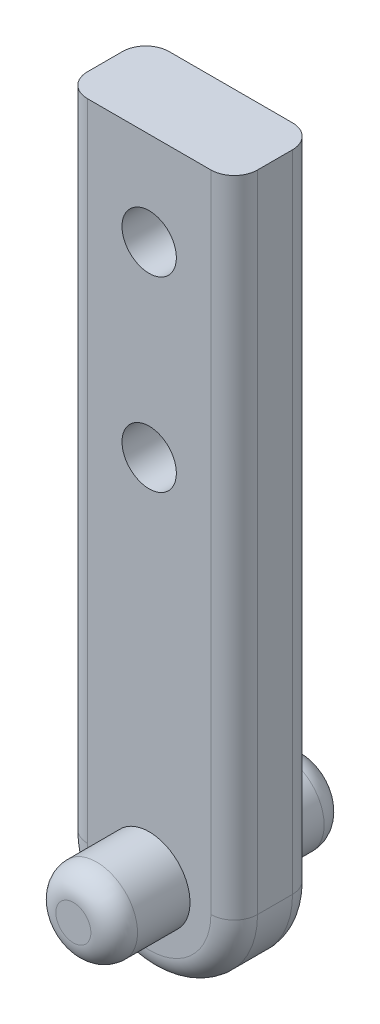
ISO-10303-21;
HEADER;
FILE_DESCRIPTION(('STEP AP214'),'2;1');
FILE_NAME('part.step','',(''),(''),'','','');
FILE_SCHEMA(('AUTOMOTIVE_DESIGN { 1 0 10303 214 1 1 1 1 }'));
ENDSEC;
DATA;
#1=APPLICATION_CONTEXT('core data for automotive mechanical design processes');
#2=APPLICATION_PROTOCOL_DEFINITION('international standard','automotive_design',2000,#1);
#3=PRODUCT_CONTEXT('',#1,'mechanical');
#4=PRODUCT('Part','Part','',(#3));
#5=PRODUCT_RELATED_PRODUCT_CATEGORY('part','',(#4));
#6=PRODUCT_DEFINITION_FORMATION('','',#4);
#7=PRODUCT_DEFINITION_CONTEXT('part definition',#1,'design');
#8=PRODUCT_DEFINITION('design','',#6,#7);
#9=PRODUCT_DEFINITION_SHAPE('','',#8);
#10=(LENGTH_UNIT() NAMED_UNIT(*) SI_UNIT(.MILLI.,.METRE.));
#11=(NAMED_UNIT(*) PLANE_ANGLE_UNIT() SI_UNIT($,.RADIAN.));
#12=(NAMED_UNIT(*) SI_UNIT($,.STERADIAN.) SOLID_ANGLE_UNIT());
#13=UNCERTAINTY_MEASURE_WITH_UNIT(LENGTH_MEASURE(1.E-05),#10,'distance_accuracy_value','');
#14=(GEOMETRIC_REPRESENTATION_CONTEXT(3) GLOBAL_UNCERTAINTY_ASSIGNED_CONTEXT((#13)) GLOBAL_UNIT_ASSIGNED_CONTEXT((#10,
#11,#12)) REPRESENTATION_CONTEXT('',''));
#15=CARTESIAN_POINT('',(0.,0.,0.));
#16=DIRECTION('',(0.,0.,1.));
#17=DIRECTION('',(1.,0.,0.));
#18=AXIS2_PLACEMENT_3D('',#15,#16,#17);
#19=CARTESIAN_POINT('',(0.260455317318129,-0.276675532618033,2.77812499999999));
#20=DIRECTION('',(0.,0.,-1.));
#21=DIRECTION('',(-0.999821956453069,-0.0188694301545512,0.));
#22=AXIS2_PLACEMENT_3D('',#19,#20,#21);
#23=PLANE('',#22);
#24=CARTESIAN_POINT('',(14.7915555422028,51.2010940307651,2.77812499999999));
#25=DIRECTION('',(0.,0.,1.));
#26=DIRECTION('',(1.,0.,0.));
#27=AXIS2_PLACEMENT_3D('',#24,#25,#26);
#28=CIRCLE('',#27,1.849999983);
#29=CARTESIAN_POINT('',(16.6415555252028,51.2010940307651,2.77812499999999));
#30=VERTEX_POINT('',#29);
#31=EDGE_CURVE('E161',#30,#30,#28,.T.);
#32=ORIENTED_EDGE('',*,*,#31,.F.);
#33=EDGE_LOOP('',(#32));
#34=FACE_BOUND('',#33,.T.);
#35=CARTESIAN_POINT('',(14.7915555422028,38.5010940307651,2.77812499999999));
#36=DIRECTION('',(0.,0.,1.));
#37=DIRECTION('',(1.,0.,0.));
#38=AXIS2_PLACEMENT_3D('',#35,#36,#37);
#39=CIRCLE('',#38,1.849999983);
#40=CARTESIAN_POINT('',(16.6415555252028,38.5010940307651,2.77812499999999));
#41=VERTEX_POINT('',#40);
#42=EDGE_CURVE('E194',#41,#41,#39,.T.);
#43=ORIENTED_EDGE('',*,*,#42,.F.);
#44=EDGE_LOOP('',(#43));
#45=FACE_BOUND('',#44,.T.);
#46=DIRECTION('',(1.,0.,0.));
#47=VECTOR('',#46,1.);
#48=CARTESIAN_POINT('',(9.00392533588777,57.5510940307651,2.77812500000001));
#49=LINE('',#48,#47);
#50=CARTESIAN_POINT('',(10.5914253358878,57.5510940307651,2.77812500000001));
#51=VERTEX_POINT('',#50);
#52=CARTESIAN_POINT('',(18.9916857485179,57.5510940307651,2.778125));
#53=VERTEX_POINT('',#52);
#54=EDGE_CURVE('E184',#51,#53,#49,.T.);
#55=ORIENTED_EDGE('',*,*,#54,.F.);
#56=DIRECTION('',(0.,1.,0.));
#57=VECTOR('',#56,1.);
#58=CARTESIAN_POINT('',(10.5914253358878,-0.276675532618033,2.77812499999999));
#59=LINE('',#58,#57);
#60=CARTESIAN_POINT('',(10.5914253358875,13.66346382445,2.77812499999999));
#61=VERTEX_POINT('',#60);
#62=EDGE_CURVE('E153',#51,#61,#59,.F.);
#63=ORIENTED_EDGE('',*,*,#62,.T.);
#64=CARTESIAN_POINT('',(14.7915555422025,13.6634638244499,2.77812499999999));
#65=DIRECTION('',(0.,0.,-1.));
#66=DIRECTION('',(-1.,0.,0.));
#67=AXIS2_PLACEMENT_3D('',#64,#65,#66);
#68=CIRCLE('',#67,4.20013020631504);
#69=CARTESIAN_POINT('',(18.9916857485179,13.6634638244499,2.77812499999999));
#70=VERTEX_POINT('',#69);
#71=EDGE_CURVE('E131',#61,#70,#68,.F.);
#72=ORIENTED_EDGE('',*,*,#71,.T.);
#73=DIRECTION('',(0.,-1.,0.));
#74=VECTOR('',#73,1.);
#75=CARTESIAN_POINT('',(18.9916857485179,-0.276675532618027,2.77812499999998));
#76=LINE('',#75,#74);
#77=EDGE_CURVE('E150',#70,#53,#76,.F.);
#78=ORIENTED_EDGE('',*,*,#77,.T.);
#79=EDGE_LOOP('',(#55,#63,#72,#78));
#80=FACE_BOUND('',#79,.T.);
#81=CARTESIAN_POINT('',(14.7915555422025,13.6634638244499,2.77812499999999));
#82=DIRECTION('',(0.,0.,-1.));
#83=DIRECTION('',(-1.,0.,0.));
#84=AXIS2_PLACEMENT_3D('',#81,#82,#83);
#85=CIRCLE('',#84,2.778125);
#86=CARTESIAN_POINT('',(12.0134305422025,13.6634638244499,2.77812499999999));
#87=VERTEX_POINT('',#86);
#88=EDGE_CURVE('E202',#87,#87,#85,.F.);
#89=ORIENTED_EDGE('',*,*,#88,.F.);
#90=EDGE_LOOP('',(#89));
#91=FACE_BOUND('',#90,.T.);
#92=ADVANCED_FACE('F35',(#34,#45,#80,#91),#23,.F.);
#93=CARTESIAN_POINT('',(0.260455317318127,-0.276675532618031,-2.77812500000001));
#94=DIRECTION('',(0.,0.,-1.));
#95=DIRECTION('',(-0.999821956453069,-0.0188694301545512,0.));
#96=AXIS2_PLACEMENT_3D('',#93,#94,#95);
#97=PLANE('',#96);
#98=CARTESIAN_POINT('',(14.7915555422028,51.2010940307651,-2.778125));
#99=DIRECTION('',(0.,0.,-1.));
#100=DIRECTION('',(-1.,0.,0.));
#101=AXIS2_PLACEMENT_3D('',#98,#99,#100);
#102=CIRCLE('',#101,1.849999983);
#103=CARTESIAN_POINT('',(12.9415555592028,51.2010940307651,-2.778125));
#104=VERTEX_POINT('',#103);
#105=EDGE_CURVE('E195',#104,#104,#102,.T.);
#106=ORIENTED_EDGE('',*,*,#105,.F.);
#107=EDGE_LOOP('',(#106));
#108=FACE_BOUND('',#107,.T.);
#109=CARTESIAN_POINT('',(14.7915555422028,38.5010940307651,-2.778125));
#110=DIRECTION('',(0.,0.,-1.));
#111=DIRECTION('',(-1.,0.,0.));
#112=AXIS2_PLACEMENT_3D('',#109,#110,#111);
#113=CIRCLE('',#112,1.849999983);
#114=CARTESIAN_POINT('',(12.9415555592028,38.5010940307651,-2.778125));
#115=VERTEX_POINT('',#114);
#116=EDGE_CURVE('E191',#115,#115,#113,.T.);
#117=ORIENTED_EDGE('',*,*,#116,.F.);
#118=EDGE_LOOP('',(#117));
#119=FACE_BOUND('',#118,.T.);
#120=CARTESIAN_POINT('',(14.7915555422025,13.6634638244499,-2.77812500000001));
#121=DIRECTION('',(0.,0.,-1.));
#122=DIRECTION('',(-1.,0.,0.));
#123=AXIS2_PLACEMENT_3D('',#120,#121,#122);
#124=CIRCLE('',#123,4.20013020631504);
#125=CARTESIAN_POINT('',(18.9916857485179,13.6634638244499,-2.77812500000001));
#126=VERTEX_POINT('',#125);
#127=CARTESIAN_POINT('',(10.5914253358875,13.66346382445,-2.77812500000001));
#128=VERTEX_POINT('',#127);
#129=EDGE_CURVE('E52',#126,#128,#124,.T.);
#130=ORIENTED_EDGE('',*,*,#129,.T.);
#131=DIRECTION('',(0.,-1.,0.));
#132=VECTOR('',#131,1.);
#133=CARTESIAN_POINT('',(10.5914253358878,57.5510940307651,-2.778125));
#134=LINE('',#133,#132);
#135=CARTESIAN_POINT('',(10.5914253358878,57.5510940307651,-2.77812499999999));
#136=VERTEX_POINT('',#135);
#137=EDGE_CURVE('E158',#128,#136,#134,.F.);
#138=ORIENTED_EDGE('',*,*,#137,.T.);
#139=DIRECTION('',(-1.,0.,0.));
#140=VECTOR('',#139,1.);
#141=CARTESIAN_POINT('',(9.0039253358878,57.5510940307651,-2.77812499999999));
#142=LINE('',#141,#140);
#143=CARTESIAN_POINT('',(18.9916857485179,57.5510940307651,-2.778125));
#144=VERTEX_POINT('',#143);
#145=EDGE_CURVE('E125',#144,#136,#142,.T.);
#146=ORIENTED_EDGE('',*,*,#145,.F.);
#147=DIRECTION('',(0.,1.,0.));
#148=VECTOR('',#147,1.);
#149=CARTESIAN_POINT('',(18.9916857485179,13.6634638244499,-2.77812500000001));
#150=LINE('',#149,#148);
#151=EDGE_CURVE('E57',#144,#126,#150,.F.);
#152=ORIENTED_EDGE('',*,*,#151,.T.);
#153=EDGE_LOOP('',(#130,#138,#146,#152));
#154=FACE_BOUND('',#153,.T.);
#155=CARTESIAN_POINT('',(14.7915555422025,13.6634638244499,-2.77812500000001));
#156=DIRECTION('',(0.,0.,-1.));
#157=DIRECTION('',(-1.,0.,0.));
#158=AXIS2_PLACEMENT_3D('',#155,#156,#157);
#159=CIRCLE('',#158,2.778125);
#160=CARTESIAN_POINT('',(12.0134305422025,13.6634638244499,-2.77812500000001));
#161=VERTEX_POINT('',#160);
#162=EDGE_CURVE('E188',#161,#161,#159,.F.);
#163=ORIENTED_EDGE('',*,*,#162,.T.);
#164=EDGE_LOOP('',(#163));
#165=FACE_BOUND('',#164,.T.);
#166=ADVANCED_FACE('F236',(#108,#119,#154,#165),#97,.T.);
#167=CARTESIAN_POINT('',(9.00392533588779,13.66346382445,54.1810599407839));
#168=DIRECTION('',(1.,0.,0.));
#169=DIRECTION('',(0.,0.,-1.));
#170=AXIS2_PLACEMENT_3D('',#167,#168,#169);
#171=PLANE('',#170);
#172=DIRECTION('',(0.,0.,-1.));
#173=VECTOR('',#172,1.);
#174=CARTESIAN_POINT('',(9.00392533588779,13.66346382445,54.1810599407839));
#175=LINE('',#174,#173);
#176=CARTESIAN_POINT('',(9.00392533588779,13.66346382445,1.19062499999999));
#177=VERTEX_POINT('',#176);
#178=CARTESIAN_POINT('',(9.00392533588779,13.66346382445,-1.19062500000001));
#179=VERTEX_POINT('',#178);
#180=EDGE_CURVE('E105',#177,#179,#175,.T.);
#181=ORIENTED_EDGE('',*,*,#180,.F.);
#182=DIRECTION('',(0.,1.,0.));
#183=VECTOR('',#182,1.);
#184=CARTESIAN_POINT('',(9.00392533588779,13.66346382445,1.19062499999999));
#185=LINE('',#184,#183);
#186=CARTESIAN_POINT('',(9.00392533588779,57.5510940307651,1.19062500000001));
#187=VERTEX_POINT('',#186);
#188=EDGE_CURVE('E120',#177,#187,#185,.T.);
#189=ORIENTED_EDGE('',*,*,#188,.T.);
#190=DIRECTION('',(0.,0.,-1.));
#191=VECTOR('',#190,1.);
#192=CARTESIAN_POINT('',(9.00392533588779,57.5510940307651,54.1810599407839));
#193=LINE('',#192,#191);
#194=CARTESIAN_POINT('',(9.00392533588779,57.5510940307651,-1.19062499999999));
#195=VERTEX_POINT('',#194);
#196=EDGE_CURVE('E124',#187,#195,#193,.T.);
#197=ORIENTED_EDGE('',*,*,#196,.T.);
#198=DIRECTION('',(0.,-1.,0.));
#199=VECTOR('',#198,1.);
#200=CARTESIAN_POINT('',(9.00392533588779,13.66346382445,-1.19062500000001));
#201=LINE('',#200,#199);
#202=EDGE_CURVE('E123',#195,#179,#201,.T.);
#203=ORIENTED_EDGE('',*,*,#202,.T.);
#204=EDGE_LOOP('',(#181,#189,#197,#203));
#205=FACE_BOUND('',#204,.T.);
#206=ADVANCED_FACE('F117',(#205),#171,.F.);
#207=CARTESIAN_POINT('',(9.00392533588779,57.5510940307651,54.1810599407839));
#208=DIRECTION('',(0.,-1.,0.));
#209=DIRECTION('',(0.,0.,-1.));
#210=AXIS2_PLACEMENT_3D('',#207,#208,#209);
#211=PLANE('',#210);
#212=ORIENTED_EDGE('',*,*,#196,.F.);
#213=CARTESIAN_POINT('',(10.5914253358878,57.5510940307651,1.19062500000001));
#214=DIRECTION('',(0.,-1.,0.));
#215=DIRECTION('',(0.,0.,-1.));
#216=AXIS2_PLACEMENT_3D('',#213,#214,#215);
#217=CIRCLE('',#216,1.5875);
#218=EDGE_CURVE('E137',#187,#51,#217,.F.);
#219=ORIENTED_EDGE('',*,*,#218,.T.);
#220=ORIENTED_EDGE('',*,*,#54,.T.);
#221=CARTESIAN_POINT('',(18.9916857485179,57.5510940307651,1.19062500000001));
#222=DIRECTION('',(0.,-1.,0.));
#223=DIRECTION('',(0.,0.,-1.));
#224=AXIS2_PLACEMENT_3D('',#221,#222,#223);
#225=CIRCLE('',#224,1.5875);
#226=CARTESIAN_POINT('',(20.5791857485179,57.5510940307651,1.19062500000001));
#227=VERTEX_POINT('',#226);
#228=EDGE_CURVE('E140',#53,#227,#225,.F.);
#229=ORIENTED_EDGE('',*,*,#228,.T.);
#230=DIRECTION('',(0.,0.,-1.));
#231=VECTOR('',#230,1.);
#232=CARTESIAN_POINT('',(20.5791857485179,57.5510940307651,54.1810599407839));
#233=LINE('',#232,#231);
#234=CARTESIAN_POINT('',(20.5791857485179,57.5510940307651,-1.19062499999999));
#235=VERTEX_POINT('',#234);
#236=EDGE_CURVE('E176',#227,#235,#233,.T.);
#237=ORIENTED_EDGE('',*,*,#236,.T.);
#238=CARTESIAN_POINT('',(18.9916857485179,57.5510940307651,-1.190625));
#239=DIRECTION('',(0.,-1.,0.));
#240=DIRECTION('',(0.,0.,-1.));
#241=AXIS2_PLACEMENT_3D('',#238,#239,#240);
#242=CIRCLE('',#241,1.5875);
#243=EDGE_CURVE('E138',#235,#144,#242,.F.);
#244=ORIENTED_EDGE('',*,*,#243,.T.);
#245=ORIENTED_EDGE('',*,*,#145,.T.);
#246=CARTESIAN_POINT('',(10.5914253358878,57.5510940307651,-1.190625));
#247=DIRECTION('',(0.,-1.,0.));
#248=DIRECTION('',(0.,0.,-1.));
#249=AXIS2_PLACEMENT_3D('',#246,#247,#248);
#250=CIRCLE('',#249,1.5875);
#251=EDGE_CURVE('E147',#136,#195,#250,.F.);
#252=ORIENTED_EDGE('',*,*,#251,.T.);
#253=EDGE_LOOP('',(#212,#219,#220,#229,#237,#244,#245,#252));
#254=FACE_BOUND('',#253,.T.);
#255=ADVANCED_FACE('F179',(#254),#211,.F.);
#256=CARTESIAN_POINT('',(20.5791857485179,13.6634638244499,54.1810599407839));
#257=DIRECTION('',(-1.,0.,0.));
#258=DIRECTION('',(0.,-1.,0.));
#259=AXIS2_PLACEMENT_3D('',#256,#257,#258);
#260=PLANE('',#259);
#261=ORIENTED_EDGE('',*,*,#236,.F.);
#262=DIRECTION('',(0.,-1.,0.));
#263=VECTOR('',#262,1.);
#264=CARTESIAN_POINT('',(20.5791857485179,13.6634638244499,1.19062499999999));
#265=LINE('',#264,#263);
#266=CARTESIAN_POINT('',(20.5791857485179,13.6634638244499,1.19062499999999));
#267=VERTEX_POINT('',#266);
#268=EDGE_CURVE('E12',#227,#267,#265,.T.);
#269=ORIENTED_EDGE('',*,*,#268,.T.);
#270=DIRECTION('',(0.,0.,-1.));
#271=VECTOR('',#270,1.);
#272=CARTESIAN_POINT('',(20.5791857485179,13.6634638244499,54.1810599407839));
#273=LINE('',#272,#271);
#274=CARTESIAN_POINT('',(20.5791857485179,13.6634638244499,-1.19062500000001));
#275=VERTEX_POINT('',#274);
#276=EDGE_CURVE('E107',#267,#275,#273,.T.);
#277=ORIENTED_EDGE('',*,*,#276,.T.);
#278=DIRECTION('',(0.,1.,0.));
#279=VECTOR('',#278,1.);
#280=CARTESIAN_POINT('',(20.5791857485179,57.5510940307651,-1.190625));
#281=LINE('',#280,#279);
#282=EDGE_CURVE('E44',#275,#235,#281,.T.);
#283=ORIENTED_EDGE('',*,*,#282,.T.);
#284=EDGE_LOOP('',(#261,#269,#277,#283));
#285=FACE_BOUND('',#284,.T.);
#286=ADVANCED_FACE('F175',(#285),#260,.F.);
#287=CARTESIAN_POINT('',(14.7915555422025,13.6634638244499,54.1810599407839));
#288=DIRECTION('',(0.,0.,-1.));
#289=DIRECTION('',(-1.,0.,0.));
#290=AXIS2_PLACEMENT_3D('',#287,#288,#289);
#291=CYLINDRICAL_SURFACE('',#290,5.78763020631504);
#292=ORIENTED_EDGE('',*,*,#276,.F.);
#293=CARTESIAN_POINT('',(14.7915555422025,13.6634638244499,1.19062499999999));
#294=DIRECTION('',(0.,0.,-1.));
#295=DIRECTION('',(-1.,0.,0.));
#296=AXIS2_PLACEMENT_3D('',#293,#294,#295);
#297=CIRCLE('',#296,5.78763020631504);
#298=EDGE_CURVE('E102',#267,#177,#297,.T.);
#299=ORIENTED_EDGE('',*,*,#298,.T.);
#300=ORIENTED_EDGE('',*,*,#180,.T.);
#301=CARTESIAN_POINT('',(14.7915555422025,13.6634638244499,-1.19062500000001));
#302=DIRECTION('',(0.,0.,-1.));
#303=DIRECTION('',(-1.,0.,0.));
#304=AXIS2_PLACEMENT_3D('',#301,#302,#303);
#305=CIRCLE('',#304,5.78763020631504);
#306=EDGE_CURVE('E112',#179,#275,#305,.F.);
#307=ORIENTED_EDGE('',*,*,#306,.T.);
#308=EDGE_LOOP('',(#292,#299,#300,#307));
#309=FACE_BOUND('',#308,.T.);
#310=ADVANCED_FACE('F104',(#309),#291,.T.);
#311=CARTESIAN_POINT('',(14.7915555422025,13.6634638244499,-7.9375));
#312=DIRECTION('',(0.,0.,1.));
#313=DIRECTION('',(1.,0.,0.));
#314=AXIS2_PLACEMENT_3D('',#311,#312,#313);
#315=PLANE('',#314);
#316=CARTESIAN_POINT('',(14.7915555422025,13.6634638244499,-7.9375));
#317=DIRECTION('',(0.,0.,1.));
#318=DIRECTION('',(1.,0.,0.));
#319=AXIS2_PLACEMENT_3D('',#316,#317,#318);
#320=CIRCLE('',#319,1.190625);
#321=CARTESIAN_POINT('',(15.9821805422025,13.6634638244499,-7.9375));
#322=VERTEX_POINT('',#321);
#323=EDGE_CURVE('E201',#322,#322,#320,.F.);
#324=ORIENTED_EDGE('',*,*,#323,.T.);
#325=EDGE_LOOP('',(#324));
#326=FACE_BOUND('',#325,.T.);
#327=ADVANCED_FACE('F255',(#326),#315,.F.);
#328=CARTESIAN_POINT('',(14.7915555422025,13.6634638244499,7.9375));
#329=DIRECTION('',(0.,0.,-1.));
#330=DIRECTION('',(-1.,0.,0.));
#331=AXIS2_PLACEMENT_3D('',#328,#329,#330);
#332=CYLINDRICAL_SURFACE('',#331,2.778125);
#333=CARTESIAN_POINT('',(14.7915555422025,13.6634638244499,-6.35));
#334=DIRECTION('',(0.,0.,1.));
#335=DIRECTION('',(1.,0.,0.));
#336=AXIS2_PLACEMENT_3D('',#333,#334,#335);
#337=CIRCLE('',#336,2.778125);
#338=CARTESIAN_POINT('',(17.5696805422025,13.6634638244499,-6.35));
#339=VERTEX_POINT('',#338);
#340=EDGE_CURVE('E198',#339,#339,#337,.T.);
#341=ORIENTED_EDGE('',*,*,#340,.T.);
#342=EDGE_LOOP('',(#341));
#343=FACE_BOUND('',#342,.T.);
#344=ORIENTED_EDGE('',*,*,#162,.F.);
#345=EDGE_LOOP('',(#344));
#346=FACE_BOUND('',#345,.T.);
#347=ADVANCED_FACE('F232',(#343,#346),#332,.T.);
#348=CARTESIAN_POINT('',(14.7915555422025,13.6634638244499,6.35));
#349=DIRECTION('',(0.,0.,1.));
#350=DIRECTION('',(1.,0.,0.));
#351=AXIS2_PLACEMENT_3D('',#348,#349,#350);
#352=CIRCLE('',#351,2.778125);
#353=CARTESIAN_POINT('',(17.5696805422025,13.6634638244499,6.35));
#354=VERTEX_POINT('',#353);
#355=EDGE_CURVE('E142',#354,#354,#352,.F.);
#356=ORIENTED_EDGE('',*,*,#355,.T.);
#357=EDGE_LOOP('',(#356));
#358=FACE_BOUND('',#357,.T.);
#359=ORIENTED_EDGE('',*,*,#88,.T.);
#360=EDGE_LOOP('',(#359));
#361=FACE_BOUND('',#360,.T.);
#362=ADVANCED_FACE('F210',(#358,#361),#332,.T.);
#363=CARTESIAN_POINT('',(14.7915555422025,13.6634638244499,7.9375));
#364=DIRECTION('',(0.,0.,1.));
#365=DIRECTION('',(1.,0.,0.));
#366=AXIS2_PLACEMENT_3D('',#363,#364,#365);
#367=PLANE('',#366);
#368=CARTESIAN_POINT('',(14.7915555422025,13.6634638244499,7.9375));
#369=DIRECTION('',(0.,0.,1.));
#370=DIRECTION('',(1.,0.,0.));
#371=AXIS2_PLACEMENT_3D('',#368,#369,#370);
#372=CIRCLE('',#371,1.190625);
#373=CARTESIAN_POINT('',(15.9821805422025,13.6634638244499,7.9375));
#374=VERTEX_POINT('',#373);
#375=EDGE_CURVE('E205',#374,#374,#372,.T.);
#376=ORIENTED_EDGE('',*,*,#375,.T.);
#377=EDGE_LOOP('',(#376));
#378=FACE_BOUND('',#377,.T.);
#379=ADVANCED_FACE('F221',(#378),#367,.T.);
#380=CARTESIAN_POINT('',(14.7915555422028,38.5010940307651,2.77812499999999));
#381=DIRECTION('',(0.,0.,1.));
#382=DIRECTION('',(1.,0.,0.));
#383=AXIS2_PLACEMENT_3D('',#380,#381,#382);
#384=CYLINDRICAL_SURFACE('',#383,1.849999983);
#385=ORIENTED_EDGE('',*,*,#116,.T.);
#386=EDGE_LOOP('',(#385));
#387=FACE_BOUND('',#386,.T.);
#388=ORIENTED_EDGE('',*,*,#42,.T.);
#389=EDGE_LOOP('',(#388));
#390=FACE_BOUND('',#389,.T.);
#391=ADVANCED_FACE('F223',(#387,#390),#384,.F.);
#392=CARTESIAN_POINT('',(14.7915555422028,51.2010940307651,2.77812499999999));
#393=DIRECTION('',(0.,0.,1.));
#394=DIRECTION('',(1.,0.,0.));
#395=AXIS2_PLACEMENT_3D('',#392,#393,#394);
#396=CYLINDRICAL_SURFACE('',#395,1.849999983);
#397=ORIENTED_EDGE('',*,*,#105,.T.);
#398=EDGE_LOOP('',(#397));
#399=FACE_BOUND('',#398,.T.);
#400=ORIENTED_EDGE('',*,*,#31,.T.);
#401=EDGE_LOOP('',(#400));
#402=FACE_BOUND('',#401,.T.);
#403=ADVANCED_FACE('F229',(#399,#402),#396,.F.);
#404=CARTESIAN_POINT('',(14.7915555422025,13.6634638244499,-6.35));
#405=DIRECTION('',(0.,0.,1.));
#406=DIRECTION('',(1.,0.,0.));
#407=AXIS2_PLACEMENT_3D('',#404,#405,#406);
#408=DEGENERATE_TOROIDAL_SURFACE('',#407,1.190625,1.5875,.T.);
#409=ORIENTED_EDGE('',*,*,#323,.F.);
#410=EDGE_LOOP('',(#409));
#411=FACE_BOUND('',#410,.T.);
#412=ORIENTED_EDGE('',*,*,#340,.F.);
#413=EDGE_LOOP('',(#412));
#414=FACE_BOUND('',#413,.T.);
#415=ADVANCED_FACE('F217',(#411,#414),#408,.T.);
#416=CARTESIAN_POINT('',(14.7915555422025,13.6634638244499,6.35));
#417=DIRECTION('',(0.,0.,1.));
#418=DIRECTION('',(1.,0.,0.));
#419=AXIS2_PLACEMENT_3D('',#416,#417,#418);
#420=DEGENERATE_TOROIDAL_SURFACE('',#419,1.190625,1.5875,.T.);
#421=ORIENTED_EDGE('',*,*,#355,.F.);
#422=EDGE_LOOP('',(#421));
#423=FACE_BOUND('',#422,.T.);
#424=ORIENTED_EDGE('',*,*,#375,.F.);
#425=EDGE_LOOP('',(#424));
#426=FACE_BOUND('',#425,.T.);
#427=ADVANCED_FACE('F213',(#423,#426),#420,.T.);
#428=CARTESIAN_POINT('',(18.9916857485179,13.6634638244499,1.19062499999999));
#429=DIRECTION('',(0.,-1.,0.));
#430=DIRECTION('',(1.,0.,0.));
#431=AXIS2_PLACEMENT_3D('',#428,#429,#430);
#432=CYLINDRICAL_SURFACE('',#431,1.5875);
#433=ORIENTED_EDGE('',*,*,#228,.F.);
#434=ORIENTED_EDGE('',*,*,#77,.F.);
#435=CARTESIAN_POINT('',(18.9916857485179,13.6634638244499,1.19062499999999));
#436=DIRECTION('',(0.,-1.,0.));
#437=DIRECTION('',(0.,0.,-1.));
#438=AXIS2_PLACEMENT_3D('',#435,#436,#437);
#439=CIRCLE('',#438,1.5875);
#440=EDGE_CURVE('E134',#267,#70,#439,.T.);
#441=ORIENTED_EDGE('',*,*,#440,.F.);
#442=ORIENTED_EDGE('',*,*,#268,.F.);
#443=EDGE_LOOP('',(#433,#434,#441,#442));
#444=FACE_BOUND('',#443,.T.);
#445=ADVANCED_FACE('F216',(#444),#432,.T.);
#446=CARTESIAN_POINT('',(14.7915555422025,13.6634638244499,1.19062499999999));
#447=DIRECTION('',(0.,0.,-1.));
#448=DIRECTION('',(-1.,0.,0.));
#449=AXIS2_PLACEMENT_3D('',#446,#447,#448);
#450=TOROIDAL_SURFACE('',#449,4.20013020631504,1.5875);
#451=ORIENTED_EDGE('',*,*,#440,.T.);
#452=ORIENTED_EDGE('',*,*,#71,.F.);
#453=CARTESIAN_POINT('',(10.5914253358875,13.6634638244499,1.190625));
#454=DIRECTION('',(0.,1.,0.));
#455=DIRECTION('',(0.,0.,1.));
#456=AXIS2_PLACEMENT_3D('',#453,#454,#455);
#457=CIRCLE('',#456,1.5875);
#458=EDGE_CURVE('E129',#177,#61,#457,.T.);
#459=ORIENTED_EDGE('',*,*,#458,.F.);
#460=ORIENTED_EDGE('',*,*,#298,.F.);
#461=EDGE_LOOP('',(#451,#452,#459,#460));
#462=FACE_BOUND('',#461,.T.);
#463=ADVANCED_FACE('F130',(#462),#450,.T.);
#464=CARTESIAN_POINT('',(10.5914253358878,13.66346382445,1.19062499999999));
#465=DIRECTION('',(0.,1.,0.));
#466=DIRECTION('',(0.,0.,1.));
#467=AXIS2_PLACEMENT_3D('',#464,#465,#466);
#468=CYLINDRICAL_SURFACE('',#467,1.5875);
#469=ORIENTED_EDGE('',*,*,#458,.T.);
#470=ORIENTED_EDGE('',*,*,#62,.F.);
#471=ORIENTED_EDGE('',*,*,#218,.F.);
#472=ORIENTED_EDGE('',*,*,#188,.F.);
#473=EDGE_LOOP('',(#469,#470,#471,#472));
#474=FACE_BOUND('',#473,.T.);
#475=ADVANCED_FACE('F136',(#474),#468,.T.);
#476=CARTESIAN_POINT('',(18.9916857485179,13.6634638244499,-1.19062500000001));
#477=DIRECTION('',(0.,-1.,0.));
#478=DIRECTION('',(1.,0.,0.));
#479=AXIS2_PLACEMENT_3D('',#476,#477,#478);
#480=CYLINDRICAL_SURFACE('',#479,1.5875);
#481=ORIENTED_EDGE('',*,*,#243,.F.);
#482=ORIENTED_EDGE('',*,*,#282,.F.);
#483=CARTESIAN_POINT('',(18.9916857485179,13.6634638244499,-1.19062500000001));
#484=DIRECTION('',(0.,-1.,0.));
#485=DIRECTION('',(0.,0.,-1.));
#486=AXIS2_PLACEMENT_3D('',#483,#484,#485);
#487=CIRCLE('',#486,1.5875);
#488=EDGE_CURVE('E39',#126,#275,#487,.T.);
#489=ORIENTED_EDGE('',*,*,#488,.F.);
#490=ORIENTED_EDGE('',*,*,#151,.F.);
#491=EDGE_LOOP('',(#481,#482,#489,#490));
#492=FACE_BOUND('',#491,.T.);
#493=ADVANCED_FACE('F37',(#492),#480,.T.);
#494=CARTESIAN_POINT('',(14.7915555422025,13.6634638244499,-1.19062500000001));
#495=DIRECTION('',(0.,0.,-1.));
#496=DIRECTION('',(-1.,0.,0.));
#497=AXIS2_PLACEMENT_3D('',#494,#495,#496);
#498=TOROIDAL_SURFACE('',#497,4.20013020631504,1.5875);
#499=ORIENTED_EDGE('',*,*,#488,.T.);
#500=ORIENTED_EDGE('',*,*,#306,.F.);
#501=CARTESIAN_POINT('',(10.5914253358875,13.66346382445,-1.19062500000001));
#502=DIRECTION('',(0.,1.,0.));
#503=DIRECTION('',(0.,0.,1.));
#504=AXIS2_PLACEMENT_3D('',#501,#502,#503);
#505=CIRCLE('',#504,1.5875);
#506=EDGE_CURVE('E162',#128,#179,#505,.T.);
#507=ORIENTED_EDGE('',*,*,#506,.F.);
#508=ORIENTED_EDGE('',*,*,#129,.F.);
#509=EDGE_LOOP('',(#499,#500,#507,#508));
#510=FACE_BOUND('',#509,.T.);
#511=ADVANCED_FACE('F168',(#510),#498,.T.);
#512=CARTESIAN_POINT('',(10.5914253358878,13.66346382445,-1.19062500000001));
#513=DIRECTION('',(0.,1.,0.));
#514=DIRECTION('',(0.,0.,1.));
#515=AXIS2_PLACEMENT_3D('',#512,#513,#514);
#516=CYLINDRICAL_SURFACE('',#515,1.5875);
#517=ORIENTED_EDGE('',*,*,#251,.F.);
#518=ORIENTED_EDGE('',*,*,#137,.F.);
#519=ORIENTED_EDGE('',*,*,#506,.T.);
#520=ORIENTED_EDGE('',*,*,#202,.F.);
#521=EDGE_LOOP('',(#517,#518,#519,#520));
#522=FACE_BOUND('',#521,.T.);
#523=ADVANCED_FACE('F266',(#522),#516,.T.);
#524=CLOSED_SHELL('',(#92,#166,#206,#255,#286,#310,#327,#347,#362,#379,#391,#403,#415,#427,#445,
#463,#475,#493,#511,#523));
#525=MANIFOLD_SOLID_BREP('B2',#524);
#526=ADVANCED_BREP_SHAPE_REPRESENTATION('',(#18,#525),#14);
#527=SHAPE_DEFINITION_REPRESENTATION(#9,#526);
ENDSEC;
END-ISO-10303-21;
